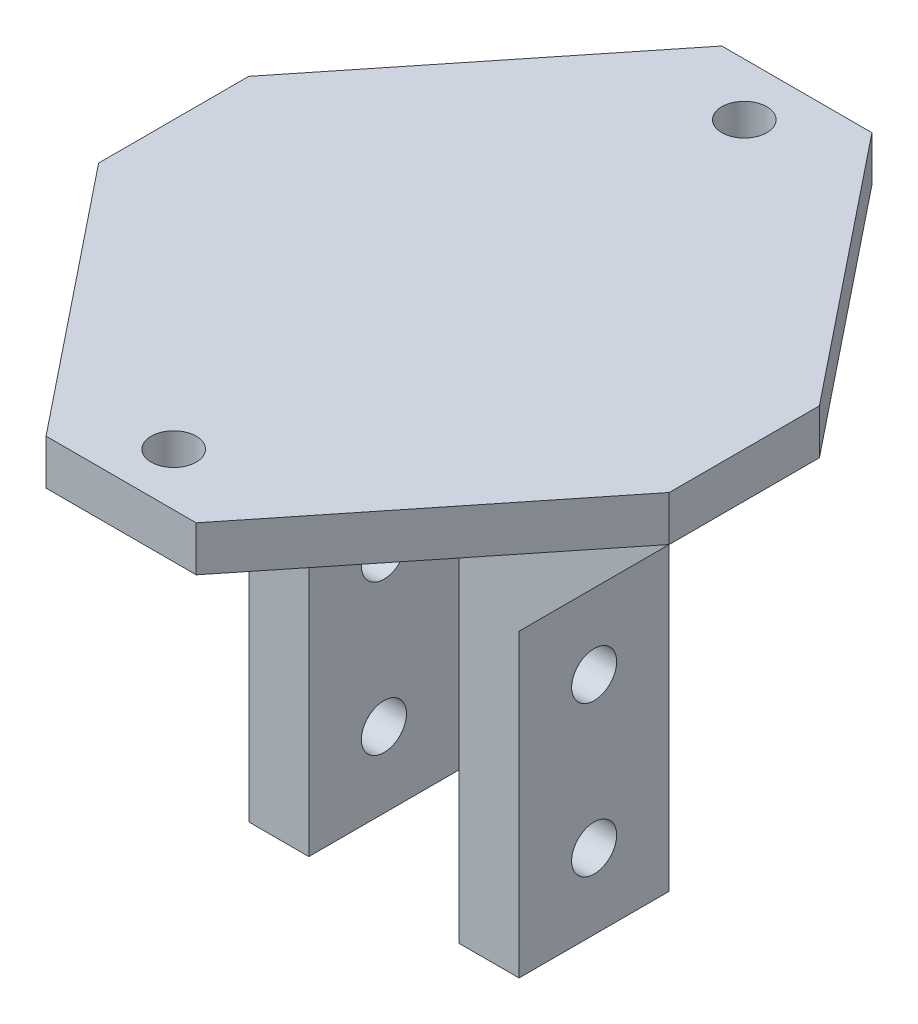
ISO-10303-21;
HEADER;
FILE_DESCRIPTION(('STEP AP214'),'2;1');
FILE_NAME('part.step','',(''),(''),'','','');
FILE_SCHEMA(('AUTOMOTIVE_DESIGN { 1 0 10303 214 1 1 1 1 }'));
ENDSEC;
DATA;
#1=APPLICATION_CONTEXT('core data for automotive mechanical design processes');
#2=APPLICATION_PROTOCOL_DEFINITION('international standard','automotive_design',2000,#1);
#3=PRODUCT_CONTEXT('',#1,'mechanical');
#4=PRODUCT('Part','Part','',(#3));
#5=PRODUCT_RELATED_PRODUCT_CATEGORY('part','',(#4));
#6=PRODUCT_DEFINITION_FORMATION('','',#4);
#7=PRODUCT_DEFINITION_CONTEXT('part definition',#1,'design');
#8=PRODUCT_DEFINITION('design','',#6,#7);
#9=PRODUCT_DEFINITION_SHAPE('','',#8);
#10=(LENGTH_UNIT() NAMED_UNIT(*) SI_UNIT(.MILLI.,.METRE.));
#11=(NAMED_UNIT(*) PLANE_ANGLE_UNIT() SI_UNIT($,.RADIAN.));
#12=(NAMED_UNIT(*) SI_UNIT($,.STERADIAN.) SOLID_ANGLE_UNIT());
#13=UNCERTAINTY_MEASURE_WITH_UNIT(LENGTH_MEASURE(1.E-05),#10,'distance_accuracy_value','');
#14=(GEOMETRIC_REPRESENTATION_CONTEXT(3) GLOBAL_UNCERTAINTY_ASSIGNED_CONTEXT((#13)) GLOBAL_UNIT_ASSIGNED_CONTEXT((#10,
#11,#12)) REPRESENTATION_CONTEXT('',''));
#15=CARTESIAN_POINT('',(0.,0.,0.));
#16=DIRECTION('',(0.,0.,1.));
#17=DIRECTION('',(1.,0.,0.));
#18=AXIS2_PLACEMENT_3D('',#15,#16,#17);
#19=CARTESIAN_POINT('',(0.,0.,0.));
#20=DIRECTION('',(0.,1.,0.));
#21=DIRECTION('',(0.,0.,1.));
#22=AXIS2_PLACEMENT_3D('',#19,#20,#21);
#23=PLANE('',#22);
#24=CARTESIAN_POINT('',(0.,0.,19.));
#25=DIRECTION('',(0.,-1.,0.));
#26=DIRECTION('',(0.,0.,-1.));
#27=AXIS2_PLACEMENT_3D('',#24,#25,#26);
#28=CIRCLE('',#27,1.5);
#29=CARTESIAN_POINT('',(0.,0.,17.5));
#30=VERTEX_POINT('',#29);
#31=EDGE_CURVE('E308',#30,#30,#28,.T.);
#32=ORIENTED_EDGE('',*,*,#31,.F.);
#33=EDGE_LOOP('',(#32));
#34=FACE_BOUND('',#33,.T.);
#35=CARTESIAN_POINT('',(0.,0.,-19.));
#36=DIRECTION('',(0.,-1.,0.));
#37=DIRECTION('',(0.,0.,-1.));
#38=AXIS2_PLACEMENT_3D('',#35,#36,#37);
#39=CIRCLE('',#38,1.5);
#40=CARTESIAN_POINT('',(0.,0.,-20.5));
#41=VERTEX_POINT('',#40);
#42=EDGE_CURVE('E314',#41,#41,#39,.T.);
#43=ORIENTED_EDGE('',*,*,#42,.F.);
#44=EDGE_LOOP('',(#43));
#45=FACE_BOUND('',#44,.T.);
#46=DIRECTION('',(1.,0.,0.));
#47=VECTOR('',#46,1.);
#48=CARTESIAN_POINT('',(-18.9999999999997,-2.53804969585518E-13,-5.));
#49=LINE('',#48,#47);
#50=CARTESIAN_POINT('',(-18.9999999999997,-2.53804969585518E-13,-5.));
#51=VERTEX_POINT('',#50);
#52=CARTESIAN_POINT('',(-5.,0.,-5.));
#53=VERTEX_POINT('',#52);
#54=EDGE_CURVE('E167',#51,#53,#49,.T.);
#55=ORIENTED_EDGE('',*,*,#54,.F.);
#56=DIRECTION('',(-0.624695047554418,0.,0.780868809443036));
#57=VECTOR('',#56,1.);
#58=CARTESIAN_POINT('',(-14.0243902439024,0.,-11.2195121951218));
#59=LINE('',#58,#57);
#60=CARTESIAN_POINT('',(-4.99999999999999,0.,-22.5));
#61=VERTEX_POINT('',#60);
#62=EDGE_CURVE('E152',#61,#51,#59,.T.);
#63=ORIENTED_EDGE('',*,*,#62,.F.);
#64=DIRECTION('',(-1.,0.,0.));
#65=VECTOR('',#64,1.);
#66=CARTESIAN_POINT('',(-19.,0.,-22.5));
#67=LINE('',#66,#65);
#68=CARTESIAN_POINT('',(5.00000000000002,0.,-22.5));
#69=VERTEX_POINT('',#68);
#70=EDGE_CURVE('E165',#69,#61,#67,.T.);
#71=ORIENTED_EDGE('',*,*,#70,.F.);
#72=DIRECTION('',(0.624695047554417,0.,0.780868809443036));
#73=VECTOR('',#72,1.);
#74=CARTESIAN_POINT('',(14.0243902439024,0.,-11.2195121951217));
#75=LINE('',#74,#73);
#76=CARTESIAN_POINT('',(18.9999999999998,0.,-4.99999999999998));
#77=VERTEX_POINT('',#76);
#78=EDGE_CURVE('E51',#69,#77,#75,.T.);
#79=ORIENTED_EDGE('',*,*,#78,.T.);
#80=DIRECTION('',(-1.,0.,0.));
#81=VECTOR('',#80,1.);
#82=CARTESIAN_POINT('',(18.9999999999997,-2.53804969585518E-13,-5.00000000000001));
#83=LINE('',#82,#81);
#84=CARTESIAN_POINT('',(5.,0.,-5.));
#85=VERTEX_POINT('',#84);
#86=EDGE_CURVE('E320',#77,#85,#83,.T.);
#87=ORIENTED_EDGE('',*,*,#86,.T.);
#88=DIRECTION('',(0.,0.,-1.));
#89=VECTOR('',#88,1.);
#90=CARTESIAN_POINT('',(5.,0.,5.));
#91=LINE('',#90,#89);
#92=CARTESIAN_POINT('',(5.,0.,5.));
#93=VERTEX_POINT('',#92);
#94=EDGE_CURVE('E202',#93,#85,#91,.T.);
#95=ORIENTED_EDGE('',*,*,#94,.F.);
#96=DIRECTION('',(-1.,0.,0.));
#97=VECTOR('',#96,1.);
#98=CARTESIAN_POINT('',(18.9999999999997,-2.53804969585518E-13,4.99999999999999));
#99=LINE('',#98,#97);
#100=CARTESIAN_POINT('',(18.9999999999997,-2.53804969585518E-13,4.99999999999999));
#101=VERTEX_POINT('',#100);
#102=EDGE_CURVE('E321',#101,#93,#99,.T.);
#103=ORIENTED_EDGE('',*,*,#102,.F.);
#104=DIRECTION('',(0.624695047554417,0.,-0.780868809443036));
#105=VECTOR('',#104,1.);
#106=CARTESIAN_POINT('',(14.0243902439024,0.,11.2195121951217));
#107=LINE('',#106,#105);
#108=CARTESIAN_POINT('',(5.00000000000001,0.,22.5));
#109=VERTEX_POINT('',#108);
#110=EDGE_CURVE('E403',#109,#101,#107,.T.);
#111=ORIENTED_EDGE('',*,*,#110,.F.);
#112=DIRECTION('',(1.,0.,0.));
#113=VECTOR('',#112,1.);
#114=CARTESIAN_POINT('',(-19.,0.,22.5));
#115=LINE('',#114,#113);
#116=CARTESIAN_POINT('',(-5.,0.,22.5));
#117=VERTEX_POINT('',#116);
#118=EDGE_CURVE('E170',#117,#109,#115,.T.);
#119=ORIENTED_EDGE('',*,*,#118,.F.);
#120=DIRECTION('',(-0.624695047554417,0.,-0.780868809443036));
#121=VECTOR('',#120,1.);
#122=CARTESIAN_POINT('',(-14.0243902439024,0.,11.2195121951217));
#123=LINE('',#122,#121);
#124=CARTESIAN_POINT('',(-18.9999999999997,0.,5.));
#125=VERTEX_POINT('',#124);
#126=EDGE_CURVE('E270',#117,#125,#123,.T.);
#127=ORIENTED_EDGE('',*,*,#126,.T.);
#128=DIRECTION('',(1.,0.,0.));
#129=VECTOR('',#128,1.);
#130=CARTESIAN_POINT('',(-18.9999999999997,-2.53804969585518E-13,5.));
#131=LINE('',#130,#129);
#132=CARTESIAN_POINT('',(-5.,0.,5.));
#133=VERTEX_POINT('',#132);
#134=EDGE_CURVE('E185',#125,#133,#131,.T.);
#135=ORIENTED_EDGE('',*,*,#134,.T.);
#136=DIRECTION('',(0.,0.,-1.));
#137=VECTOR('',#136,1.);
#138=CARTESIAN_POINT('',(-5.,0.,5.));
#139=LINE('',#138,#137);
#140=EDGE_CURVE('E195',#133,#53,#139,.T.);
#141=ORIENTED_EDGE('',*,*,#140,.T.);
#142=EDGE_LOOP('',(#55,#63,#71,#79,#87,#95,#103,#111,#119,#127,#135,#141));
#143=FACE_BOUND('',#142,.T.);
#144=ADVANCED_FACE('F35',(#34,#45,#143),#23,.F.);
#145=CARTESIAN_POINT('',(0.,3.,0.));
#146=DIRECTION('',(0.,1.,0.));
#147=DIRECTION('',(0.,0.,1.));
#148=AXIS2_PLACEMENT_3D('',#145,#146,#147);
#149=PLANE('',#148);
#150=DIRECTION('',(0.624695047554418,0.,-0.780868809443036));
#151=VECTOR('',#150,1.);
#152=CARTESIAN_POINT('',(-14.0243902439024,3.,-11.2195121951217));
#153=LINE('',#152,#151);
#154=CARTESIAN_POINT('',(-18.9999999999997,3.,-5.));
#155=VERTEX_POINT('',#154);
#156=CARTESIAN_POINT('',(-4.99999999999999,3.,-22.5));
#157=VERTEX_POINT('',#156);
#158=EDGE_CURVE('E155',#155,#157,#153,.T.);
#159=ORIENTED_EDGE('',*,*,#158,.F.);
#160=DIRECTION('',(0.,0.,1.));
#161=VECTOR('',#160,1.);
#162=CARTESIAN_POINT('',(-19.,3.,-22.5));
#163=LINE('',#162,#161);
#164=CARTESIAN_POINT('',(-18.9999999999997,3.,5.));
#165=VERTEX_POINT('',#164);
#166=EDGE_CURVE('E225',#155,#165,#163,.T.);
#167=ORIENTED_EDGE('',*,*,#166,.T.);
#168=DIRECTION('',(0.624695047554417,0.,0.780868809443036));
#169=VECTOR('',#168,1.);
#170=CARTESIAN_POINT('',(-14.0243902439024,3.,11.2195121951217));
#171=LINE('',#170,#169);
#172=CARTESIAN_POINT('',(-5.,3.,22.5));
#173=VERTEX_POINT('',#172);
#174=EDGE_CURVE('E280',#165,#173,#171,.T.);
#175=ORIENTED_EDGE('',*,*,#174,.T.);
#176=DIRECTION('',(1.,0.,0.));
#177=VECTOR('',#176,1.);
#178=CARTESIAN_POINT('',(-19.,3.,22.5));
#179=LINE('',#178,#177);
#180=CARTESIAN_POINT('',(5.00000000000001,3.,22.5));
#181=VERTEX_POINT('',#180);
#182=EDGE_CURVE('E180',#173,#181,#179,.T.);
#183=ORIENTED_EDGE('',*,*,#182,.T.);
#184=DIRECTION('',(-0.624695047554417,0.,0.780868809443036));
#185=VECTOR('',#184,1.);
#186=CARTESIAN_POINT('',(14.0243902439024,3.,11.2195121951217));
#187=LINE('',#186,#185);
#188=CARTESIAN_POINT('',(18.9999999999997,3.,4.99999999999999));
#189=VERTEX_POINT('',#188);
#190=EDGE_CURVE('E272',#189,#181,#187,.T.);
#191=ORIENTED_EDGE('',*,*,#190,.F.);
#192=DIRECTION('',(0.,0.,-1.));
#193=VECTOR('',#192,1.);
#194=CARTESIAN_POINT('',(19.,3.,-22.5));
#195=LINE('',#194,#193);
#196=CARTESIAN_POINT('',(18.9999999999998,3.,-4.99999999999998));
#197=VERTEX_POINT('',#196);
#198=EDGE_CURVE('E174',#189,#197,#195,.T.);
#199=ORIENTED_EDGE('',*,*,#198,.T.);
#200=DIRECTION('',(-0.624695047554417,0.,-0.780868809443037));
#201=VECTOR('',#200,1.);
#202=CARTESIAN_POINT('',(14.0243902439025,3.,-11.2195121951217));
#203=LINE('',#202,#201);
#204=CARTESIAN_POINT('',(5.00000000000002,3.,-22.5));
#205=VERTEX_POINT('',#204);
#206=EDGE_CURVE('E396',#197,#205,#203,.T.);
#207=ORIENTED_EDGE('',*,*,#206,.T.);
#208=DIRECTION('',(-1.,0.,0.));
#209=VECTOR('',#208,1.);
#210=CARTESIAN_POINT('',(-19.,3.,-22.5));
#211=LINE('',#210,#209);
#212=EDGE_CURVE('E224',#205,#157,#211,.T.);
#213=ORIENTED_EDGE('',*,*,#212,.T.);
#214=EDGE_LOOP('',(#159,#167,#175,#183,#191,#199,#207,#213));
#215=FACE_BOUND('',#214,.T.);
#216=CARTESIAN_POINT('',(0.,3.,19.));
#217=DIRECTION('',(0.,-1.,0.));
#218=DIRECTION('',(0.,0.,-1.));
#219=AXIS2_PLACEMENT_3D('',#216,#217,#218);
#220=CIRCLE('',#219,1.5);
#221=CARTESIAN_POINT('',(0.,3.,17.5));
#222=VERTEX_POINT('',#221);
#223=EDGE_CURVE('E311',#222,#222,#220,.T.);
#224=ORIENTED_EDGE('',*,*,#223,.T.);
#225=EDGE_LOOP('',(#224));
#226=FACE_BOUND('',#225,.T.);
#227=CARTESIAN_POINT('',(0.,3.,-19.));
#228=DIRECTION('',(0.,-1.,0.));
#229=DIRECTION('',(0.,0.,-1.));
#230=AXIS2_PLACEMENT_3D('',#227,#228,#229);
#231=CIRCLE('',#230,1.5);
#232=CARTESIAN_POINT('',(0.,3.,-20.5));
#233=VERTEX_POINT('',#232);
#234=EDGE_CURVE('E317',#233,#233,#231,.T.);
#235=ORIENTED_EDGE('',*,*,#234,.T.);
#236=EDGE_LOOP('',(#235));
#237=FACE_BOUND('',#236,.T.);
#238=ADVANCED_FACE('F373',(#215,#226,#237),#149,.T.);
#239=CARTESIAN_POINT('',(19.,3.,-22.5));
#240=DIRECTION('',(-1.,0.,0.));
#241=DIRECTION('',(0.,0.,1.));
#242=AXIS2_PLACEMENT_3D('',#239,#240,#241);
#243=PLANE('',#242);
#244=DIRECTION('',(0.,-1.,0.));
#245=VECTOR('',#244,1.);
#246=CARTESIAN_POINT('',(18.9999999999998,200.,-4.99999999999998));
#247=LINE('',#246,#245);
#248=EDGE_CURVE('E394',#197,#77,#247,.T.);
#249=ORIENTED_EDGE('',*,*,#248,.F.);
#250=ORIENTED_EDGE('',*,*,#198,.F.);
#251=DIRECTION('',(0.,-1.,0.));
#252=VECTOR('',#251,1.);
#253=CARTESIAN_POINT('',(19.,3.,4.99999999999968));
#254=LINE('',#253,#252);
#255=EDGE_CURVE('E44',#189,#101,#254,.T.);
#256=ORIENTED_EDGE('',*,*,#255,.T.);
#257=DIRECTION('',(0.,0.,-1.));
#258=VECTOR('',#257,1.);
#259=CARTESIAN_POINT('',(18.9999999999997,-2.53804969585518E-13,4.99999999999999));
#260=LINE('',#259,#258);
#261=EDGE_CURVE('E333',#101,#77,#260,.T.);
#262=ORIENTED_EDGE('',*,*,#261,.T.);
#263=EDGE_LOOP('',(#249,#250,#256,#262));
#264=FACE_BOUND('',#263,.T.);
#265=ADVANCED_FACE('F37',(#264),#243,.F.);
#266=CARTESIAN_POINT('',(-19.,3.,-22.5));
#267=DIRECTION('',(0.,0.,1.));
#268=DIRECTION('',(1.,0.,0.));
#269=AXIS2_PLACEMENT_3D('',#266,#267,#268);
#270=PLANE('',#269);
#271=ORIENTED_EDGE('',*,*,#70,.T.);
#272=DIRECTION('',(0.,-1.,0.));
#273=VECTOR('',#272,1.);
#274=CARTESIAN_POINT('',(-4.99999999999999,200.,-22.5));
#275=LINE('',#274,#273);
#276=EDGE_CURVE('E149',#157,#61,#275,.T.);
#277=ORIENTED_EDGE('',*,*,#276,.F.);
#278=ORIENTED_EDGE('',*,*,#212,.F.);
#279=DIRECTION('',(0.,1.,0.));
#280=VECTOR('',#279,1.);
#281=CARTESIAN_POINT('',(5.00000000000002,3.,-22.5));
#282=LINE('',#281,#280);
#283=EDGE_CURVE('E11',#69,#205,#282,.T.);
#284=ORIENTED_EDGE('',*,*,#283,.F.);
#285=EDGE_LOOP('',(#271,#277,#278,#284));
#286=FACE_BOUND('',#285,.T.);
#287=ADVANCED_FACE('F169',(#286),#270,.F.);
#288=CARTESIAN_POINT('',(-19.,3.,-22.5));
#289=DIRECTION('',(1.,0.,0.));
#290=DIRECTION('',(0.,0.,-1.));
#291=AXIS2_PLACEMENT_3D('',#288,#289,#290);
#292=PLANE('',#291);
#293=ORIENTED_EDGE('',*,*,#166,.F.);
#294=DIRECTION('',(0.,-1.,0.));
#295=VECTOR('',#294,1.);
#296=CARTESIAN_POINT('',(-18.9999999999997,200.,-5.));
#297=LINE('',#296,#295);
#298=EDGE_CURVE('E160',#155,#51,#297,.T.);
#299=ORIENTED_EDGE('',*,*,#298,.T.);
#300=DIRECTION('',(0.,0.,-1.));
#301=VECTOR('',#300,1.);
#302=CARTESIAN_POINT('',(-18.9999999999997,-2.53804969585518E-13,5.));
#303=LINE('',#302,#301);
#304=EDGE_CURVE('E171',#125,#51,#303,.T.);
#305=ORIENTED_EDGE('',*,*,#304,.F.);
#306=DIRECTION('',(0.,-1.,0.));
#307=VECTOR('',#306,1.);
#308=CARTESIAN_POINT('',(-18.9999999999997,200.,5.));
#309=LINE('',#308,#307);
#310=EDGE_CURVE('E273',#165,#125,#309,.T.);
#311=ORIENTED_EDGE('',*,*,#310,.F.);
#312=EDGE_LOOP('',(#293,#299,#305,#311));
#313=FACE_BOUND('',#312,.T.);
#314=ADVANCED_FACE('F244',(#313),#292,.F.);
#315=CARTESIAN_POINT('',(-19.,3.,22.5));
#316=DIRECTION('',(0.,0.,-1.));
#317=DIRECTION('',(-1.,0.,0.));
#318=AXIS2_PLACEMENT_3D('',#315,#316,#317);
#319=PLANE('',#318);
#320=ORIENTED_EDGE('',*,*,#118,.T.);
#321=DIRECTION('',(0.,-1.,0.));
#322=VECTOR('',#321,1.);
#323=CARTESIAN_POINT('',(5.00000000000001,200.,22.5));
#324=LINE('',#323,#322);
#325=EDGE_CURVE('E275',#181,#109,#324,.T.);
#326=ORIENTED_EDGE('',*,*,#325,.F.);
#327=ORIENTED_EDGE('',*,*,#182,.F.);
#328=DIRECTION('',(0.,-1.,0.));
#329=VECTOR('',#328,1.);
#330=CARTESIAN_POINT('',(-5.,200.,22.5));
#331=LINE('',#330,#329);
#332=EDGE_CURVE('E59',#173,#117,#331,.T.);
#333=ORIENTED_EDGE('',*,*,#332,.T.);
#334=EDGE_LOOP('',(#320,#326,#327,#333));
#335=FACE_BOUND('',#334,.T.);
#336=ADVANCED_FACE('F382',(#335),#319,.F.);
#337=CARTESIAN_POINT('',(-9.00000000000013,-9.99999999999962,5.));
#338=DIRECTION('',(-0.707106781186538,-0.707106781186557,0.));
#339=DIRECTION('',(0.707106781186557,-0.707106781186538,0.));
#340=AXIS2_PLACEMENT_3D('',#337,#338,#339);
#341=PLANE('',#340);
#342=DIRECTION('',(-0.707106781186557,0.707106781186538,0.));
#343=VECTOR('',#342,1.);
#344=CARTESIAN_POINT('',(-9.00000000000012,-9.99999999999962,-5.));
#345=LINE('',#344,#343);
#346=CARTESIAN_POINT('',(-9.00000000000012,-9.99999999999962,-5.));
#347=VERTEX_POINT('',#346);
#348=EDGE_CURVE('E189',#347,#51,#345,.T.);
#349=ORIENTED_EDGE('',*,*,#348,.F.);
#350=DIRECTION('',(0.,0.,-1.));
#351=VECTOR('',#350,1.);
#352=CARTESIAN_POINT('',(-9.00000000000013,-9.99999999999962,5.));
#353=LINE('',#352,#351);
#354=CARTESIAN_POINT('',(-9.00000000000013,-9.99999999999962,5.));
#355=VERTEX_POINT('',#354);
#356=EDGE_CURVE('E177',#355,#347,#353,.T.);
#357=ORIENTED_EDGE('',*,*,#356,.F.);
#358=DIRECTION('',(-0.707106781186557,0.707106781186538,0.));
#359=VECTOR('',#358,1.);
#360=CARTESIAN_POINT('',(-9.00000000000013,-9.99999999999962,5.));
#361=LINE('',#360,#359);
#362=EDGE_CURVE('E192',#355,#125,#361,.T.);
#363=ORIENTED_EDGE('',*,*,#362,.T.);
#364=ORIENTED_EDGE('',*,*,#304,.T.);
#365=EDGE_LOOP('',(#349,#357,#363,#364));
#366=FACE_BOUND('',#365,.T.);
#367=ADVANCED_FACE('F249',(#366),#341,.T.);
#368=CARTESIAN_POINT('',(-9.00000000000013,-29.9999999999995,5.));
#369=DIRECTION('',(-1.,0.,0.));
#370=DIRECTION('',(0.,0.,1.));
#371=AXIS2_PLACEMENT_3D('',#368,#369,#370);
#372=PLANE('',#371);
#373=CARTESIAN_POINT('',(-9.00000000000013,-24.9999999999995,0.));
#374=DIRECTION('',(-1.,0.,0.));
#375=DIRECTION('',(0.,0.,1.));
#376=AXIS2_PLACEMENT_3D('',#373,#374,#375);
#377=CIRCLE('',#376,1.49999999999999);
#378=CARTESIAN_POINT('',(-9.00000000000013,-24.9999999999995,1.5));
#379=VERTEX_POINT('',#378);
#380=EDGE_CURVE('E293',#379,#379,#377,.T.);
#381=ORIENTED_EDGE('',*,*,#380,.F.);
#382=EDGE_LOOP('',(#381));
#383=FACE_BOUND('',#382,.T.);
#384=CARTESIAN_POINT('',(-9.00000000000013,-14.9999999999996,0.));
#385=DIRECTION('',(-1.,0.,0.));
#386=DIRECTION('',(0.,0.,1.));
#387=AXIS2_PLACEMENT_3D('',#384,#385,#386);
#388=CIRCLE('',#387,1.49999999999999);
#389=CARTESIAN_POINT('',(-9.00000000000013,-14.9999999999996,1.5));
#390=VERTEX_POINT('',#389);
#391=EDGE_CURVE('E305',#390,#390,#388,.T.);
#392=ORIENTED_EDGE('',*,*,#391,.F.);
#393=EDGE_LOOP('',(#392));
#394=FACE_BOUND('',#393,.T.);
#395=DIRECTION('',(0.,1.,0.));
#396=VECTOR('',#395,1.);
#397=CARTESIAN_POINT('',(-9.00000000000013,-29.9999999999995,-5.));
#398=LINE('',#397,#396);
#399=CARTESIAN_POINT('',(-9.00000000000013,-29.9999999999995,-5.));
#400=VERTEX_POINT('',#399);
#401=EDGE_CURVE('E213',#400,#347,#398,.T.);
#402=ORIENTED_EDGE('',*,*,#401,.F.);
#403=DIRECTION('',(0.,0.,-1.));
#404=VECTOR('',#403,1.);
#405=CARTESIAN_POINT('',(-9.00000000000013,-29.9999999999995,5.));
#406=LINE('',#405,#404);
#407=CARTESIAN_POINT('',(-9.00000000000013,-29.9999999999995,5.));
#408=VERTEX_POINT('',#407);
#409=EDGE_CURVE('E217',#408,#400,#406,.T.);
#410=ORIENTED_EDGE('',*,*,#409,.F.);
#411=DIRECTION('',(0.,1.,0.));
#412=VECTOR('',#411,1.);
#413=CARTESIAN_POINT('',(-9.00000000000013,-29.9999999999995,5.));
#414=LINE('',#413,#412);
#415=EDGE_CURVE('E196',#408,#355,#414,.T.);
#416=ORIENTED_EDGE('',*,*,#415,.T.);
#417=ORIENTED_EDGE('',*,*,#356,.T.);
#418=EDGE_LOOP('',(#402,#410,#416,#417));
#419=FACE_BOUND('',#418,.T.);
#420=ADVANCED_FACE('F257',(#383,#394,#419),#372,.T.);
#421=CARTESIAN_POINT('',(-5.,-29.9999999999995,5.));
#422=DIRECTION('',(0.,-1.,0.));
#423=DIRECTION('',(0.,0.,-1.));
#424=AXIS2_PLACEMENT_3D('',#421,#422,#423);
#425=PLANE('',#424);
#426=DIRECTION('',(-1.,0.,0.));
#427=VECTOR('',#426,1.);
#428=CARTESIAN_POINT('',(-5.,-29.9999999999995,-5.));
#429=LINE('',#428,#427);
#430=CARTESIAN_POINT('',(-5.,-29.9999999999995,-5.));
#431=VERTEX_POINT('',#430);
#432=EDGE_CURVE('E210',#431,#400,#429,.T.);
#433=ORIENTED_EDGE('',*,*,#432,.F.);
#434=DIRECTION('',(0.,0.,-1.));
#435=VECTOR('',#434,1.);
#436=CARTESIAN_POINT('',(-5.,-29.9999999999995,5.));
#437=LINE('',#436,#435);
#438=CARTESIAN_POINT('',(-5.,-29.9999999999995,5.));
#439=VERTEX_POINT('',#438);
#440=EDGE_CURVE('E219',#439,#431,#437,.T.);
#441=ORIENTED_EDGE('',*,*,#440,.F.);
#442=DIRECTION('',(-1.,0.,0.));
#443=VECTOR('',#442,1.);
#444=CARTESIAN_POINT('',(-5.,-29.9999999999995,5.));
#445=LINE('',#444,#443);
#446=EDGE_CURVE('E263',#439,#408,#445,.T.);
#447=ORIENTED_EDGE('',*,*,#446,.T.);
#448=ORIENTED_EDGE('',*,*,#409,.T.);
#449=EDGE_LOOP('',(#433,#441,#447,#448));
#450=FACE_BOUND('',#449,.T.);
#451=ADVANCED_FACE('F357',(#450),#425,.T.);
#452=CARTESIAN_POINT('',(-5.,0.,5.));
#453=DIRECTION('',(1.,0.,0.));
#454=DIRECTION('',(0.,0.,-1.));
#455=AXIS2_PLACEMENT_3D('',#452,#453,#454);
#456=PLANE('',#455);
#457=CARTESIAN_POINT('',(-5.,-24.9999999999995,0.));
#458=DIRECTION('',(1.,0.,0.));
#459=DIRECTION('',(0.,0.,-1.));
#460=AXIS2_PLACEMENT_3D('',#457,#458,#459);
#461=CIRCLE('',#460,1.49999999999999);
#462=CARTESIAN_POINT('',(-5.,-24.9999999999995,-1.49999999999999));
#463=VERTEX_POINT('',#462);
#464=EDGE_CURVE('E290',#463,#463,#461,.T.);
#465=ORIENTED_EDGE('',*,*,#464,.F.);
#466=EDGE_LOOP('',(#465));
#467=FACE_BOUND('',#466,.T.);
#468=CARTESIAN_POINT('',(-5.,-14.9999999999996,0.));
#469=DIRECTION('',(1.,0.,0.));
#470=DIRECTION('',(0.,0.,-1.));
#471=AXIS2_PLACEMENT_3D('',#468,#469,#470);
#472=CIRCLE('',#471,1.49999999999999);
#473=CARTESIAN_POINT('',(-5.,-14.9999999999996,-1.49999999999999));
#474=VERTEX_POINT('',#473);
#475=EDGE_CURVE('E302',#474,#474,#472,.T.);
#476=ORIENTED_EDGE('',*,*,#475,.F.);
#477=EDGE_LOOP('',(#476));
#478=FACE_BOUND('',#477,.T.);
#479=DIRECTION('',(0.,-1.,0.));
#480=VECTOR('',#479,1.);
#481=CARTESIAN_POINT('',(-5.,0.,-5.));
#482=LINE('',#481,#480);
#483=EDGE_CURVE('E201',#53,#431,#482,.T.);
#484=ORIENTED_EDGE('',*,*,#483,.F.);
#485=ORIENTED_EDGE('',*,*,#140,.F.);
#486=DIRECTION('',(0.,-1.,0.));
#487=VECTOR('',#486,1.);
#488=CARTESIAN_POINT('',(-5.,0.,5.));
#489=LINE('',#488,#487);
#490=EDGE_CURVE('E188',#133,#439,#489,.T.);
#491=ORIENTED_EDGE('',*,*,#490,.T.);
#492=ORIENTED_EDGE('',*,*,#440,.T.);
#493=EDGE_LOOP('',(#484,#485,#491,#492));
#494=FACE_BOUND('',#493,.T.);
#495=ADVANCED_FACE('F359',(#467,#478,#494),#456,.T.);
#496=CARTESIAN_POINT('',(0.,0.,5.));
#497=DIRECTION('',(0.,0.,-1.));
#498=DIRECTION('',(-1.,0.,0.));
#499=AXIS2_PLACEMENT_3D('',#496,#497,#498);
#500=PLANE('',#499);
#501=ORIENTED_EDGE('',*,*,#134,.F.);
#502=ORIENTED_EDGE('',*,*,#362,.F.);
#503=ORIENTED_EDGE('',*,*,#415,.F.);
#504=ORIENTED_EDGE('',*,*,#446,.F.);
#505=ORIENTED_EDGE('',*,*,#490,.F.);
#506=EDGE_LOOP('',(#501,#502,#503,#504,#505));
#507=FACE_BOUND('',#506,.T.);
#508=ADVANCED_FACE('F265',(#507),#500,.F.);
#509=CARTESIAN_POINT('',(0.,0.,-5.));
#510=DIRECTION('',(0.,0.,-1.));
#511=DIRECTION('',(-1.,0.,0.));
#512=AXIS2_PLACEMENT_3D('',#509,#510,#511);
#513=PLANE('',#512);
#514=ORIENTED_EDGE('',*,*,#54,.T.);
#515=ORIENTED_EDGE('',*,*,#483,.T.);
#516=ORIENTED_EDGE('',*,*,#432,.T.);
#517=ORIENTED_EDGE('',*,*,#401,.T.);
#518=ORIENTED_EDGE('',*,*,#348,.T.);
#519=EDGE_LOOP('',(#514,#515,#516,#517,#518));
#520=FACE_BOUND('',#519,.T.);
#521=ADVANCED_FACE('F252',(#520),#513,.T.);
#522=CARTESIAN_POINT('',(5.,0.,5.));
#523=DIRECTION('',(1.,0.,0.));
#524=DIRECTION('',(0.,0.,-1.));
#525=AXIS2_PLACEMENT_3D('',#522,#523,#524);
#526=PLANE('',#525);
#527=CARTESIAN_POINT('',(5.,-24.9999999999995,0.));
#528=DIRECTION('',(1.,0.,0.));
#529=DIRECTION('',(0.,0.,-1.));
#530=AXIS2_PLACEMENT_3D('',#527,#528,#529);
#531=CIRCLE('',#530,1.49999999999999);
#532=CARTESIAN_POINT('',(5.,-24.9999999999995,-1.49999999999999));
#533=VERTEX_POINT('',#532);
#534=EDGE_CURVE('E285',#533,#533,#531,.T.);
#535=ORIENTED_EDGE('',*,*,#534,.T.);
#536=EDGE_LOOP('',(#535));
#537=FACE_BOUND('',#536,.T.);
#538=CARTESIAN_POINT('',(5.,-14.9999999999996,0.));
#539=DIRECTION('',(1.,0.,0.));
#540=DIRECTION('',(0.,0.,-1.));
#541=AXIS2_PLACEMENT_3D('',#538,#539,#540);
#542=CIRCLE('',#541,1.49999999999999);
#543=CARTESIAN_POINT('',(5.,-14.9999999999996,-1.49999999999999));
#544=VERTEX_POINT('',#543);
#545=EDGE_CURVE('E299',#544,#544,#542,.T.);
#546=ORIENTED_EDGE('',*,*,#545,.T.);
#547=EDGE_LOOP('',(#546));
#548=FACE_BOUND('',#547,.T.);
#549=DIRECTION('',(0.,-1.,0.));
#550=VECTOR('',#549,1.);
#551=CARTESIAN_POINT('',(5.,0.,-5.));
#552=LINE('',#551,#550);
#553=CARTESIAN_POINT('',(5.,-29.9999999999995,-5.));
#554=VERTEX_POINT('',#553);
#555=EDGE_CURVE('E325',#85,#554,#552,.T.);
#556=ORIENTED_EDGE('',*,*,#555,.T.);
#557=DIRECTION('',(0.,0.,-1.));
#558=VECTOR('',#557,1.);
#559=CARTESIAN_POINT('',(5.,-29.9999999999995,5.));
#560=LINE('',#559,#558);
#561=CARTESIAN_POINT('',(5.,-29.9999999999995,5.));
#562=VERTEX_POINT('',#561);
#563=EDGE_CURVE('E346',#562,#554,#560,.T.);
#564=ORIENTED_EDGE('',*,*,#563,.F.);
#565=DIRECTION('',(0.,-1.,0.));
#566=VECTOR('',#565,1.);
#567=CARTESIAN_POINT('',(5.,0.,5.));
#568=LINE('',#567,#566);
#569=EDGE_CURVE('E331',#93,#562,#568,.T.);
#570=ORIENTED_EDGE('',*,*,#569,.F.);
#571=ORIENTED_EDGE('',*,*,#94,.T.);
#572=EDGE_LOOP('',(#556,#564,#570,#571));
#573=FACE_BOUND('',#572,.T.);
#574=ADVANCED_FACE('F430',(#537,#548,#573),#526,.F.);
#575=CARTESIAN_POINT('',(5.,-29.9999999999995,5.));
#576=DIRECTION('',(0.,1.,0.));
#577=DIRECTION('',(0.,0.,1.));
#578=AXIS2_PLACEMENT_3D('',#575,#576,#577);
#579=PLANE('',#578);
#580=DIRECTION('',(1.,0.,0.));
#581=VECTOR('',#580,1.);
#582=CARTESIAN_POINT('',(5.,-29.9999999999995,-5.));
#583=LINE('',#582,#581);
#584=CARTESIAN_POINT('',(9.00000000000012,-29.9999999999995,-5.));
#585=VERTEX_POINT('',#584);
#586=EDGE_CURVE('E341',#554,#585,#583,.T.);
#587=ORIENTED_EDGE('',*,*,#586,.T.);
#588=DIRECTION('',(0.,0.,-1.));
#589=VECTOR('',#588,1.);
#590=CARTESIAN_POINT('',(9.00000000000013,-29.9999999999995,5.));
#591=LINE('',#590,#589);
#592=CARTESIAN_POINT('',(9.00000000000013,-29.9999999999995,5.));
#593=VERTEX_POINT('',#592);
#594=EDGE_CURVE('E349',#593,#585,#591,.T.);
#595=ORIENTED_EDGE('',*,*,#594,.F.);
#596=DIRECTION('',(1.,0.,0.));
#597=VECTOR('',#596,1.);
#598=CARTESIAN_POINT('',(5.,-29.9999999999995,5.));
#599=LINE('',#598,#597);
#600=EDGE_CURVE('E329',#562,#593,#599,.T.);
#601=ORIENTED_EDGE('',*,*,#600,.F.);
#602=ORIENTED_EDGE('',*,*,#563,.T.);
#603=EDGE_LOOP('',(#587,#595,#601,#602));
#604=FACE_BOUND('',#603,.T.);
#605=ADVANCED_FACE('F426',(#604),#579,.F.);
#606=CARTESIAN_POINT('',(9.00000000000013,-29.9999999999995,5.));
#607=DIRECTION('',(-1.,0.,0.));
#608=DIRECTION('',(0.,0.,1.));
#609=AXIS2_PLACEMENT_3D('',#606,#607,#608);
#610=PLANE('',#609);
#611=CARTESIAN_POINT('',(9.00000000000013,-24.9999999999995,0.));
#612=DIRECTION('',(1.,0.,0.));
#613=DIRECTION('',(0.,0.,-1.));
#614=AXIS2_PLACEMENT_3D('',#611,#612,#613);
#615=CIRCLE('',#614,1.49999999999999);
#616=CARTESIAN_POINT('',(9.00000000000013,-24.9999999999995,-1.49999999999999));
#617=VERTEX_POINT('',#616);
#618=EDGE_CURVE('E282',#617,#617,#615,.T.);
#619=ORIENTED_EDGE('',*,*,#618,.F.);
#620=EDGE_LOOP('',(#619));
#621=FACE_BOUND('',#620,.T.);
#622=CARTESIAN_POINT('',(9.00000000000013,-14.9999999999996,0.));
#623=DIRECTION('',(1.,0.,0.));
#624=DIRECTION('',(0.,0.,-1.));
#625=AXIS2_PLACEMENT_3D('',#622,#623,#624);
#626=CIRCLE('',#625,1.49999999999999);
#627=CARTESIAN_POINT('',(9.00000000000013,-14.9999999999996,-1.49999999999999));
#628=VERTEX_POINT('',#627);
#629=EDGE_CURVE('E296',#628,#628,#626,.T.);
#630=ORIENTED_EDGE('',*,*,#629,.F.);
#631=EDGE_LOOP('',(#630));
#632=FACE_BOUND('',#631,.T.);
#633=DIRECTION('',(0.,1.,0.));
#634=VECTOR('',#633,1.);
#635=CARTESIAN_POINT('',(9.00000000000012,-29.9999999999995,-5.));
#636=LINE('',#635,#634);
#637=CARTESIAN_POINT('',(9.00000000000012,-9.99999999999962,-5.));
#638=VERTEX_POINT('',#637);
#639=EDGE_CURVE('E339',#585,#638,#636,.T.);
#640=ORIENTED_EDGE('',*,*,#639,.T.);
#641=DIRECTION('',(0.,0.,-1.));
#642=VECTOR('',#641,1.);
#643=CARTESIAN_POINT('',(9.00000000000013,-9.99999999999962,5.));
#644=LINE('',#643,#642);
#645=CARTESIAN_POINT('',(9.00000000000013,-9.99999999999962,5.));
#646=VERTEX_POINT('',#645);
#647=EDGE_CURVE('E352',#646,#638,#644,.T.);
#648=ORIENTED_EDGE('',*,*,#647,.F.);
#649=DIRECTION('',(0.,1.,0.));
#650=VECTOR('',#649,1.);
#651=CARTESIAN_POINT('',(9.00000000000013,-29.9999999999995,5.));
#652=LINE('',#651,#650);
#653=EDGE_CURVE('E327',#593,#646,#652,.T.);
#654=ORIENTED_EDGE('',*,*,#653,.F.);
#655=ORIENTED_EDGE('',*,*,#594,.T.);
#656=EDGE_LOOP('',(#640,#648,#654,#655));
#657=FACE_BOUND('',#656,.T.);
#658=ADVANCED_FACE('F423',(#621,#632,#657),#610,.F.);
#659=CARTESIAN_POINT('',(9.00000000000013,-9.99999999999962,5.));
#660=DIRECTION('',(-0.707106781186538,0.707106781186557,0.));
#661=DIRECTION('',(-0.707106781186557,-0.707106781186538,0.));
#662=AXIS2_PLACEMENT_3D('',#659,#660,#661);
#663=PLANE('',#662);
#664=DIRECTION('',(0.707106781186557,0.707106781186538,0.));
#665=VECTOR('',#664,1.);
#666=CARTESIAN_POINT('',(9.00000000000012,-9.99999999999962,-5.));
#667=LINE('',#666,#665);
#668=EDGE_CURVE('E336',#638,#77,#667,.T.);
#669=ORIENTED_EDGE('',*,*,#668,.T.);
#670=ORIENTED_EDGE('',*,*,#261,.F.);
#671=DIRECTION('',(0.707106781186557,0.707106781186538,0.));
#672=VECTOR('',#671,1.);
#673=CARTESIAN_POINT('',(9.00000000000013,-9.99999999999962,5.));
#674=LINE('',#673,#672);
#675=EDGE_CURVE('E324',#646,#101,#674,.T.);
#676=ORIENTED_EDGE('',*,*,#675,.F.);
#677=ORIENTED_EDGE('',*,*,#647,.T.);
#678=EDGE_LOOP('',(#669,#670,#676,#677));
#679=FACE_BOUND('',#678,.T.);
#680=ADVANCED_FACE('F417',(#679),#663,.F.);
#681=CARTESIAN_POINT('',(0.,0.,5.));
#682=DIRECTION('',(0.,0.,-1.));
#683=DIRECTION('',(1.,0.,0.));
#684=AXIS2_PLACEMENT_3D('',#681,#682,#683);
#685=PLANE('',#684);
#686=ORIENTED_EDGE('',*,*,#102,.T.);
#687=ORIENTED_EDGE('',*,*,#569,.T.);
#688=ORIENTED_EDGE('',*,*,#600,.T.);
#689=ORIENTED_EDGE('',*,*,#653,.T.);
#690=ORIENTED_EDGE('',*,*,#675,.T.);
#691=EDGE_LOOP('',(#686,#687,#688,#689,#690));
#692=FACE_BOUND('',#691,.T.);
#693=ADVANCED_FACE('F432',(#692),#685,.F.);
#694=CARTESIAN_POINT('',(0.,0.,-5.));
#695=DIRECTION('',(0.,0.,-1.));
#696=DIRECTION('',(1.,0.,0.));
#697=AXIS2_PLACEMENT_3D('',#694,#695,#696);
#698=PLANE('',#697);
#699=ORIENTED_EDGE('',*,*,#86,.F.);
#700=ORIENTED_EDGE('',*,*,#668,.F.);
#701=ORIENTED_EDGE('',*,*,#639,.F.);
#702=ORIENTED_EDGE('',*,*,#586,.F.);
#703=ORIENTED_EDGE('',*,*,#555,.F.);
#704=EDGE_LOOP('',(#699,#700,#701,#702,#703));
#705=FACE_BOUND('',#704,.T.);
#706=ADVANCED_FACE('F413',(#705),#698,.T.);
#707=CARTESIAN_POINT('',(0.,0.,-19.));
#708=DIRECTION('',(0.,-1.,0.));
#709=DIRECTION('',(0.,0.,-1.));
#710=AXIS2_PLACEMENT_3D('',#707,#708,#709);
#711=CYLINDRICAL_SURFACE('',#710,1.5);
#712=ORIENTED_EDGE('',*,*,#234,.F.);
#713=EDGE_LOOP('',(#712));
#714=FACE_BOUND('',#713,.T.);
#715=ORIENTED_EDGE('',*,*,#42,.T.);
#716=EDGE_LOOP('',(#715));
#717=FACE_BOUND('',#716,.T.);
#718=ADVANCED_FACE('F439',(#714,#717),#711,.F.);
#719=CARTESIAN_POINT('',(0.,0.,19.));
#720=DIRECTION('',(0.,-1.,0.));
#721=DIRECTION('',(0.,0.,-1.));
#722=AXIS2_PLACEMENT_3D('',#719,#720,#721);
#723=CYLINDRICAL_SURFACE('',#722,1.5);
#724=ORIENTED_EDGE('',*,*,#223,.F.);
#725=EDGE_LOOP('',(#724));
#726=FACE_BOUND('',#725,.T.);
#727=ORIENTED_EDGE('',*,*,#31,.T.);
#728=EDGE_LOOP('',(#727));
#729=FACE_BOUND('',#728,.T.);
#730=ADVANCED_FACE('F479',(#726,#729),#723,.F.);
#731=CARTESIAN_POINT('',(9.00000000000013,-14.9999999999996,0.));
#732=DIRECTION('',(1.,0.,0.));
#733=DIRECTION('',(0.,0.,-1.));
#734=AXIS2_PLACEMENT_3D('',#731,#732,#733);
#735=CYLINDRICAL_SURFACE('',#734,1.49999999999999);
#736=ORIENTED_EDGE('',*,*,#629,.T.);
#737=EDGE_LOOP('',(#736));
#738=FACE_BOUND('',#737,.T.);
#739=ORIENTED_EDGE('',*,*,#545,.F.);
#740=EDGE_LOOP('',(#739));
#741=FACE_BOUND('',#740,.T.);
#742=ADVANCED_FACE('F469',(#738,#741),#735,.F.);
#743=ORIENTED_EDGE('',*,*,#391,.T.);
#744=EDGE_LOOP('',(#743));
#745=FACE_BOUND('',#744,.T.);
#746=ORIENTED_EDGE('',*,*,#475,.T.);
#747=EDGE_LOOP('',(#746));
#748=FACE_BOUND('',#747,.T.);
#749=ADVANCED_FACE('F465',(#745,#748),#735,.F.);
#750=CARTESIAN_POINT('',(9.00000000000013,-24.9999999999995,0.));
#751=DIRECTION('',(1.,0.,0.));
#752=DIRECTION('',(0.,0.,-1.));
#753=AXIS2_PLACEMENT_3D('',#750,#751,#752);
#754=CYLINDRICAL_SURFACE('',#753,1.49999999999999);
#755=ORIENTED_EDGE('',*,*,#618,.T.);
#756=EDGE_LOOP('',(#755));
#757=FACE_BOUND('',#756,.T.);
#758=ORIENTED_EDGE('',*,*,#534,.F.);
#759=EDGE_LOOP('',(#758));
#760=FACE_BOUND('',#759,.T.);
#761=ADVANCED_FACE('F468',(#757,#760),#754,.F.);
#762=ORIENTED_EDGE('',*,*,#380,.T.);
#763=EDGE_LOOP('',(#762));
#764=FACE_BOUND('',#763,.T.);
#765=ORIENTED_EDGE('',*,*,#464,.T.);
#766=EDGE_LOOP('',(#765));
#767=FACE_BOUND('',#766,.T.);
#768=ADVANCED_FACE('F476',(#764,#767),#754,.F.);
#769=CARTESIAN_POINT('',(-14.0243902439024,200.,11.2195121951217));
#770=DIRECTION('',(-0.780868809443036,0.,0.624695047554417));
#771=DIRECTION('',(0.624695047554417,0.,0.780868809443036));
#772=AXIS2_PLACEMENT_3D('',#769,#770,#771);
#773=PLANE('',#772);
#774=ORIENTED_EDGE('',*,*,#310,.T.);
#775=ORIENTED_EDGE('',*,*,#126,.F.);
#776=ORIENTED_EDGE('',*,*,#332,.F.);
#777=ORIENTED_EDGE('',*,*,#174,.F.);
#778=EDGE_LOOP('',(#774,#775,#776,#777));
#779=FACE_BOUND('',#778,.T.);
#780=ADVANCED_FACE('F530',(#779),#773,.T.);
#781=CARTESIAN_POINT('',(14.0243902439024,200.,11.2195121951217));
#782=DIRECTION('',(-0.780868809443036,0.,-0.624695047554417));
#783=DIRECTION('',(-0.624695047554417,0.,0.780868809443036));
#784=AXIS2_PLACEMENT_3D('',#781,#782,#783);
#785=PLANE('',#784);
#786=ORIENTED_EDGE('',*,*,#190,.T.);
#787=ORIENTED_EDGE('',*,*,#325,.T.);
#788=ORIENTED_EDGE('',*,*,#110,.T.);
#789=ORIENTED_EDGE('',*,*,#255,.F.);
#790=EDGE_LOOP('',(#786,#787,#788,#789));
#791=FACE_BOUND('',#790,.T.);
#792=ADVANCED_FACE('F402',(#791),#785,.F.);
#793=CARTESIAN_POINT('',(14.0243902439024,200.,-11.2195121951217));
#794=DIRECTION('',(0.780868809443036,0.,-0.624695047554417));
#795=DIRECTION('',(-0.624695047554417,0.,-0.780868809443037));
#796=AXIS2_PLACEMENT_3D('',#793,#794,#795);
#797=PLANE('',#796);
#798=ORIENTED_EDGE('',*,*,#248,.T.);
#799=ORIENTED_EDGE('',*,*,#78,.F.);
#800=ORIENTED_EDGE('',*,*,#283,.T.);
#801=ORIENTED_EDGE('',*,*,#206,.F.);
#802=EDGE_LOOP('',(#798,#799,#800,#801));
#803=FACE_BOUND('',#802,.T.);
#804=ADVANCED_FACE('F511',(#803),#797,.T.);
#805=CARTESIAN_POINT('',(-14.0243902439024,200.,-11.2195121951218));
#806=DIRECTION('',(0.780868809443036,0.,0.624695047554417));
#807=DIRECTION('',(0.624695047554418,0.,-0.780868809443036));
#808=AXIS2_PLACEMENT_3D('',#805,#806,#807);
#809=PLANE('',#808);
#810=ORIENTED_EDGE('',*,*,#158,.T.);
#811=ORIENTED_EDGE('',*,*,#276,.T.);
#812=ORIENTED_EDGE('',*,*,#62,.T.);
#813=ORIENTED_EDGE('',*,*,#298,.F.);
#814=EDGE_LOOP('',(#810,#811,#812,#813));
#815=FACE_BOUND('',#814,.T.);
#816=ADVANCED_FACE('F151',(#815),#809,.F.);
#817=CLOSED_SHELL('',(#144,#238,#265,#287,#314,#336,#367,#420,#451,#495,#508,#521,#574,#605,
#658,#680,#693,#706,#718,#730,#742,#749,#761,#768,#780,#792,#804,#816));
#818=MANIFOLD_SOLID_BREP('B2',#817);
#819=ADVANCED_BREP_SHAPE_REPRESENTATION('',(#18,#818),#14);
#820=SHAPE_DEFINITION_REPRESENTATION(#9,#819);
ENDSEC;
END-ISO-10303-21;
